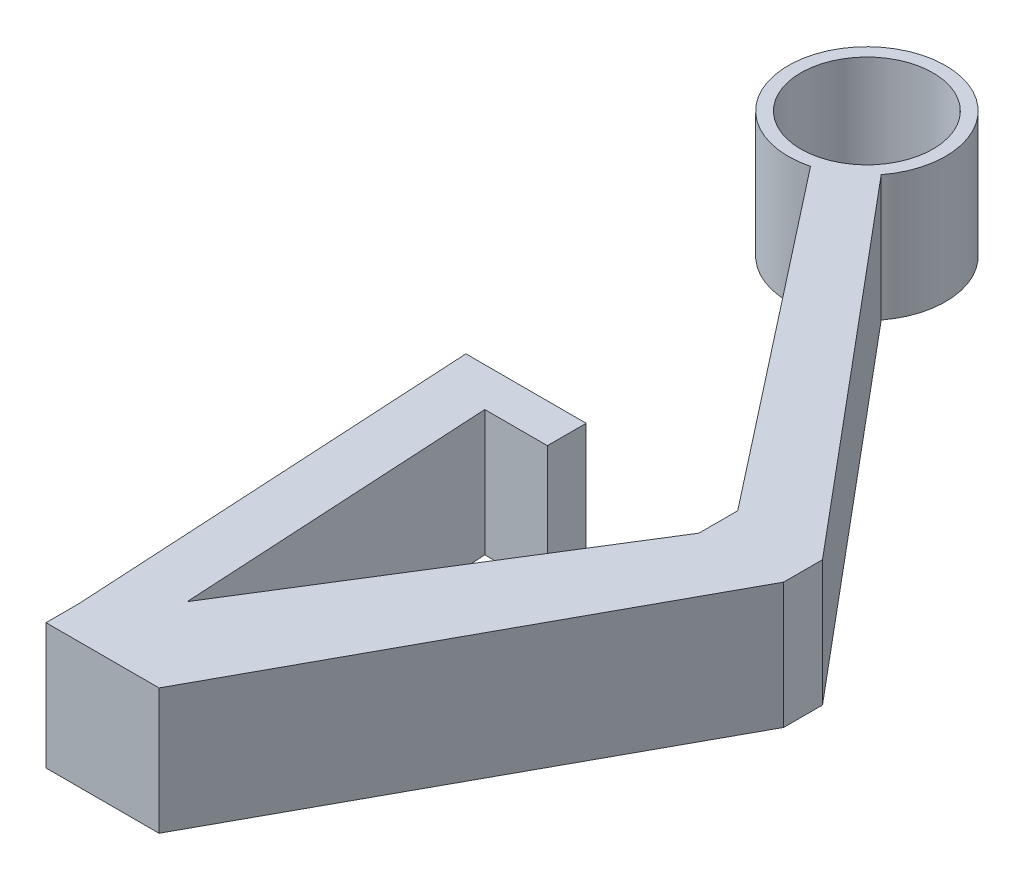
ISO-10303-21;
HEADER;
FILE_DESCRIPTION(('STEP AP214'),'2;1');
FILE_NAME('part.step','',(''),(''),'','','');
FILE_SCHEMA(('AUTOMOTIVE_DESIGN { 1 0 10303 214 1 1 1 1 }'));
ENDSEC;
DATA;
#1=APPLICATION_CONTEXT('core data for automotive mechanical design processes');
#2=APPLICATION_PROTOCOL_DEFINITION('international standard','automotive_design',2000,#1);
#3=PRODUCT_CONTEXT('',#1,'mechanical');
#4=PRODUCT('Part','Part','',(#3));
#5=PRODUCT_RELATED_PRODUCT_CATEGORY('part','',(#4));
#6=PRODUCT_DEFINITION_FORMATION('','',#4);
#7=PRODUCT_DEFINITION_CONTEXT('part definition',#1,'design');
#8=PRODUCT_DEFINITION('design','',#6,#7);
#9=PRODUCT_DEFINITION_SHAPE('','',#8);
#10=(LENGTH_UNIT() NAMED_UNIT(*) SI_UNIT(.MILLI.,.METRE.));
#11=(NAMED_UNIT(*) PLANE_ANGLE_UNIT() SI_UNIT($,.RADIAN.));
#12=(NAMED_UNIT(*) SI_UNIT($,.STERADIAN.) SOLID_ANGLE_UNIT());
#13=UNCERTAINTY_MEASURE_WITH_UNIT(LENGTH_MEASURE(1.E-05),#10,'distance_accuracy_value','');
#14=(GEOMETRIC_REPRESENTATION_CONTEXT(3) GLOBAL_UNCERTAINTY_ASSIGNED_CONTEXT((#13)) GLOBAL_UNIT_ASSIGNED_CONTEXT((#10,
#11,#12)) REPRESENTATION_CONTEXT('',''));
#15=CARTESIAN_POINT('',(0.,0.,0.));
#16=DIRECTION('',(0.,0.,1.));
#17=DIRECTION('',(1.,0.,0.));
#18=AXIS2_PLACEMENT_3D('',#15,#16,#17);
#19=CARTESIAN_POINT('',(0.,0.8,0.));
#20=DIRECTION('',(0.,-1.,0.));
#21=DIRECTION('',(0.,0.,-1.));
#22=AXIS2_PLACEMENT_3D('',#19,#20,#21);
#23=CYLINDRICAL_SURFACE('',#22,0.5);
#24=DIRECTION('',(0.,-1.,0.));
#25=VECTOR('',#24,1.);
#26=CARTESIAN_POINT('',(0.125675276411165,0.8,0.483948060125234));
#27=LINE('',#26,#25);
#28=CARTESIAN_POINT('',(0.125675276411165,0.8,0.483948060125234));
#29=VERTEX_POINT('',#28);
#30=CARTESIAN_POINT('',(0.125675276411165,0.,0.483948060125234));
#31=VERTEX_POINT('',#30);
#32=EDGE_CURVE('E11',#29,#31,#27,.T.);
#33=ORIENTED_EDGE('',*,*,#32,.F.);
#34=CARTESIAN_POINT('',(0.,0.8,0.));
#35=DIRECTION('',(0.,1.,0.));
#36=DIRECTION('',(0.,0.,1.));
#37=AXIS2_PLACEMENT_3D('',#34,#35,#36);
#38=CIRCLE('',#37,0.5);
#39=CARTESIAN_POINT('',(0.396050279808786,0.8,0.305195307734871));
#40=VERTEX_POINT('',#39);
#41=EDGE_CURVE('E44',#40,#29,#38,.T.);
#42=ORIENTED_EDGE('',*,*,#41,.F.);
#43=DIRECTION('',(0.,-1.,0.));
#44=VECTOR('',#43,1.);
#45=CARTESIAN_POINT('',(0.396050279808786,0.8,0.305195307734871));
#46=LINE('',#45,#44);
#47=CARTESIAN_POINT('',(0.396050279808786,0.,0.305195307734871));
#48=VERTEX_POINT('',#47);
#49=EDGE_CURVE('E180',#40,#48,#46,.T.);
#50=ORIENTED_EDGE('',*,*,#49,.T.);
#51=CARTESIAN_POINT('',(0.,0.,0.));
#52=DIRECTION('',(0.,1.,0.));
#53=DIRECTION('',(0.,0.,1.));
#54=AXIS2_PLACEMENT_3D('',#51,#52,#53);
#55=CIRCLE('',#54,0.5);
#56=EDGE_CURVE('E51',#48,#31,#55,.T.);
#57=ORIENTED_EDGE('',*,*,#56,.T.);
#58=EDGE_LOOP('',(#33,#42,#50,#57));
#59=FACE_BOUND('',#58,.T.);
#60=ADVANCED_FACE('F37',(#59),#23,.T.);
#61=CARTESIAN_POINT('',(0.,0.8,0.));
#62=DIRECTION('',(0.,1.,0.));
#63=DIRECTION('',(0.,0.,1.));
#64=AXIS2_PLACEMENT_3D('',#61,#62,#63);
#65=PLANE('',#64);
#66=DIRECTION('',(-0.64236019721875,0.,-0.766402881668048));
#67=VECTOR('',#66,1.);
#68=CARTESIAN_POINT('',(2.32829872516162,0.8,2.61056974255951));
#69=LINE('',#68,#67);
#70=CARTESIAN_POINT('',(2.32829872516162,0.8,2.61056974255951));
#71=VERTEX_POINT('',#70);
#72=EDGE_CURVE('E178',#71,#40,#69,.T.);
#73=ORIENTED_EDGE('',*,*,#72,.T.);
#74=ORIENTED_EDGE('',*,*,#41,.T.);
#75=DIRECTION('',(0.61623399546107,0.,0.787563116732929));
#76=VECTOR('',#75,1.);
#77=CARTESIAN_POINT('',(0.10828611230571,0.8,0.461724254913019));
#78=LINE('',#77,#76);
#79=CARTESIAN_POINT('',(1.7896645470578,0.8,2.61056974255951));
#80=VERTEX_POINT('',#79);
#81=EDGE_CURVE('E133',#29,#80,#78,.T.);
#82=ORIENTED_EDGE('',*,*,#81,.T.);
#83=DIRECTION('',(0.,0.,1.));
#84=VECTOR('',#83,1.);
#85=CARTESIAN_POINT('',(1.7896645470578,0.8,2.61056974255951));
#86=LINE('',#85,#84);
#87=CARTESIAN_POINT('',(1.7896645470578,0.8,2.85704928426543));
#88=VERTEX_POINT('',#87);
#89=EDGE_CURVE('E138',#80,#88,#86,.T.);
#90=ORIENTED_EDGE('',*,*,#89,.T.);
#91=DIRECTION('',(-0.529044610325075,0.,0.848594013816966));
#92=VECTOR('',#91,1.);
#93=CARTESIAN_POINT('',(1.7896645470578,0.8,2.85704928426543));
#94=LINE('',#93,#92);
#95=CARTESIAN_POINT('',(0.540630382350235,0.8,4.86051533332401));
#96=VERTEX_POINT('',#95);
#97=EDGE_CURVE('E156',#88,#96,#94,.T.);
#98=ORIENTED_EDGE('',*,*,#97,.T.);
#99=DIRECTION('',(-0.0556411930324533,0.,-0.998450828853342));
#100=VECTOR('',#99,1.);
#101=CARTESIAN_POINT('',(0.540630382350235,0.8,4.86051533332401));
#102=LINE('',#101,#100);
#103=CARTESIAN_POINT('',(0.428982179005402,0.8,2.85704928426543));
#104=VERTEX_POINT('',#103);
#105=EDGE_CURVE('E158',#96,#104,#102,.T.);
#106=ORIENTED_EDGE('',*,*,#105,.T.);
#107=DIRECTION('',(1.,0.,0.));
#108=VECTOR('',#107,1.);
#109=CARTESIAN_POINT('',(0.428982179005402,0.8,2.85704928426543));
#110=LINE('',#109,#108);
#111=CARTESIAN_POINT('',(0.826811996105691,0.8,2.85704928426543));
#112=VERTEX_POINT('',#111);
#113=EDGE_CURVE('E162',#104,#112,#110,.T.);
#114=ORIENTED_EDGE('',*,*,#113,.T.);
#115=DIRECTION('',(0.,0.,-1.));
#116=VECTOR('',#115,1.);
#117=CARTESIAN_POINT('',(0.826811996105691,0.8,2.85704928426543));
#118=LINE('',#117,#116);
#119=CARTESIAN_POINT('',(0.826811996105691,0.8,2.61056974255951));
#120=VERTEX_POINT('',#119);
#121=EDGE_CURVE('E164',#112,#120,#118,.T.);
#122=ORIENTED_EDGE('',*,*,#121,.T.);
#123=DIRECTION('',(-1.,0.,0.));
#124=VECTOR('',#123,1.);
#125=CARTESIAN_POINT('',(0.826811996105691,0.8,2.61056974255951));
#126=LINE('',#125,#124);
#127=CARTESIAN_POINT('',(0.0624919750122658,0.8,2.61056974255951));
#128=VERTEX_POINT('',#127);
#129=EDGE_CURVE('E166',#120,#128,#126,.T.);
#130=ORIENTED_EDGE('',*,*,#129,.T.);
#131=DIRECTION('',(0.0556411930324533,0.,0.998450828853342));
#132=VECTOR('',#131,1.);
#133=CARTESIAN_POINT('',(0.0624919750122658,0.8,2.61056974255951));
#134=LINE('',#133,#132);
#135=CARTESIAN_POINT('',(0.20781017284824,0.8,5.21822545893093));
#136=VERTEX_POINT('',#135);
#137=EDGE_CURVE('E168',#128,#136,#134,.T.);
#138=ORIENTED_EDGE('',*,*,#137,.T.);
#139=DIRECTION('',(0.,0.,1.));
#140=VECTOR('',#139,1.);
#141=CARTESIAN_POINT('',(0.20781017284824,0.8,5.21822545893093));
#142=LINE('',#141,#140);
#143=CARTESIAN_POINT('',(0.20781017284824,0.8,5.42410455342405));
#144=VERTEX_POINT('',#143);
#145=EDGE_CURVE('E170',#136,#144,#142,.T.);
#146=ORIENTED_EDGE('',*,*,#145,.T.);
#147=DIRECTION('',(1.,0.,0.));
#148=VECTOR('',#147,1.);
#149=CARTESIAN_POINT('',(0.20781017284824,0.8,5.42410455342405));
#150=LINE('',#149,#148);
#151=CARTESIAN_POINT('',(0.926078261035032,0.8,5.42410455342405));
#152=VERTEX_POINT('',#151);
#153=EDGE_CURVE('E172',#144,#152,#150,.T.);
#154=ORIENTED_EDGE('',*,*,#153,.T.);
#155=DIRECTION('',(0.479381246444352,0.,-0.877606757356311));
#156=VECTOR('',#155,1.);
#157=CARTESIAN_POINT('',(0.926078261035032,0.8,5.42410455342405));
#158=LINE('',#157,#156);
#159=CARTESIAN_POINT('',(2.32829872516162,0.8,2.85704928426543));
#160=VERTEX_POINT('',#159);
#161=EDGE_CURVE('E174',#152,#160,#158,.T.);
#162=ORIENTED_EDGE('',*,*,#161,.T.);
#163=DIRECTION('',(0.,0.,-1.));
#164=VECTOR('',#163,1.);
#165=CARTESIAN_POINT('',(2.32829872516162,0.8,2.85704928426543));
#166=LINE('',#165,#164);
#167=EDGE_CURVE('E176',#160,#71,#166,.T.);
#168=ORIENTED_EDGE('',*,*,#167,.T.);
#169=EDGE_LOOP('',(#73,#74,#82,#90,#98,#106,#114,#122,#130,#138,#146,#154,#162,#168));
#170=FACE_BOUND('',#169,.T.);
#171=CARTESIAN_POINT('',(0.,0.8,0.));
#172=DIRECTION('',(0.,1.,0.));
#173=DIRECTION('',(0.,0.,1.));
#174=AXIS2_PLACEMENT_3D('',#171,#172,#173);
#175=CIRCLE('',#174,0.42);
#176=CARTESIAN_POINT('',(0.,0.8,0.42));
#177=VERTEX_POINT('',#176);
#178=EDGE_CURVE('E238',#177,#177,#175,.T.);
#179=ORIENTED_EDGE('',*,*,#178,.F.);
#180=EDGE_LOOP('',(#179));
#181=FACE_BOUND('',#180,.T.);
#182=ADVANCED_FACE('F135',(#170,#181),#65,.T.);
#183=CARTESIAN_POINT('',(0.,0.,0.));
#184=DIRECTION('',(0.,1.,0.));
#185=DIRECTION('',(0.,0.,1.));
#186=AXIS2_PLACEMENT_3D('',#183,#184,#185);
#187=PLANE('',#186);
#188=ORIENTED_EDGE('',*,*,#56,.F.);
#189=DIRECTION('',(-0.64236019721875,0.,-0.766402881668048));
#190=VECTOR('',#189,1.);
#191=CARTESIAN_POINT('',(2.32829872516162,0.,2.61056974255951));
#192=LINE('',#191,#190);
#193=CARTESIAN_POINT('',(2.32829872516162,0.,2.61056974255951));
#194=VERTEX_POINT('',#193);
#195=EDGE_CURVE('E141',#194,#48,#192,.T.);
#196=ORIENTED_EDGE('',*,*,#195,.F.);
#197=DIRECTION('',(0.,0.,-1.));
#198=VECTOR('',#197,1.);
#199=CARTESIAN_POINT('',(2.32829872516162,0.,2.85704928426543));
#200=LINE('',#199,#198);
#201=CARTESIAN_POINT('',(2.32829872516162,0.,2.85704928426543));
#202=VERTEX_POINT('',#201);
#203=EDGE_CURVE('E202',#202,#194,#200,.T.);
#204=ORIENTED_EDGE('',*,*,#203,.F.);
#205=DIRECTION('',(0.479381246444352,0.,-0.877606757356311));
#206=VECTOR('',#205,1.);
#207=CARTESIAN_POINT('',(0.926078261035032,0.,5.42410455342405));
#208=LINE('',#207,#206);
#209=CARTESIAN_POINT('',(0.926078261035032,0.,5.42410455342405));
#210=VERTEX_POINT('',#209);
#211=EDGE_CURVE('E200',#210,#202,#208,.T.);
#212=ORIENTED_EDGE('',*,*,#211,.F.);
#213=DIRECTION('',(1.,0.,0.));
#214=VECTOR('',#213,1.);
#215=CARTESIAN_POINT('',(0.20781017284824,0.,5.42410455342405));
#216=LINE('',#215,#214);
#217=CARTESIAN_POINT('',(0.20781017284824,0.,5.42410455342405));
#218=VERTEX_POINT('',#217);
#219=EDGE_CURVE('E198',#218,#210,#216,.T.);
#220=ORIENTED_EDGE('',*,*,#219,.F.);
#221=DIRECTION('',(0.,0.,1.));
#222=VECTOR('',#221,1.);
#223=CARTESIAN_POINT('',(0.20781017284824,0.,5.21822545893093));
#224=LINE('',#223,#222);
#225=CARTESIAN_POINT('',(0.20781017284824,0.,5.21822545893093));
#226=VERTEX_POINT('',#225);
#227=EDGE_CURVE('E196',#226,#218,#224,.T.);
#228=ORIENTED_EDGE('',*,*,#227,.F.);
#229=DIRECTION('',(0.0556411930324533,0.,0.998450828853342));
#230=VECTOR('',#229,1.);
#231=CARTESIAN_POINT('',(0.0624919750122658,0.,2.61056974255951));
#232=LINE('',#231,#230);
#233=CARTESIAN_POINT('',(0.0624919750122658,0.,2.61056974255951));
#234=VERTEX_POINT('',#233);
#235=EDGE_CURVE('E194',#234,#226,#232,.T.);
#236=ORIENTED_EDGE('',*,*,#235,.F.);
#237=DIRECTION('',(-1.,0.,0.));
#238=VECTOR('',#237,1.);
#239=CARTESIAN_POINT('',(0.826811996105691,0.,2.61056974255951));
#240=LINE('',#239,#238);
#241=CARTESIAN_POINT('',(0.826811996105691,0.,2.61056974255951));
#242=VERTEX_POINT('',#241);
#243=EDGE_CURVE('E192',#242,#234,#240,.T.);
#244=ORIENTED_EDGE('',*,*,#243,.F.);
#245=DIRECTION('',(0.,0.,-1.));
#246=VECTOR('',#245,1.);
#247=CARTESIAN_POINT('',(0.826811996105691,0.,2.85704928426543));
#248=LINE('',#247,#246);
#249=CARTESIAN_POINT('',(0.826811996105691,0.,2.85704928426543));
#250=VERTEX_POINT('',#249);
#251=EDGE_CURVE('E190',#250,#242,#248,.T.);
#252=ORIENTED_EDGE('',*,*,#251,.F.);
#253=DIRECTION('',(1.,0.,0.));
#254=VECTOR('',#253,1.);
#255=CARTESIAN_POINT('',(0.428982179005402,0.,2.85704928426543));
#256=LINE('',#255,#254);
#257=CARTESIAN_POINT('',(0.428982179005402,0.,2.85704928426543));
#258=VERTEX_POINT('',#257);
#259=EDGE_CURVE('E188',#258,#250,#256,.T.);
#260=ORIENTED_EDGE('',*,*,#259,.F.);
#261=DIRECTION('',(-0.0556411930324533,0.,-0.998450828853342));
#262=VECTOR('',#261,1.);
#263=CARTESIAN_POINT('',(0.540630382350235,0.,4.86051533332401));
#264=LINE('',#263,#262);
#265=CARTESIAN_POINT('',(0.540630382350235,0.,4.86051533332401));
#266=VERTEX_POINT('',#265);
#267=EDGE_CURVE('E186',#266,#258,#264,.T.);
#268=ORIENTED_EDGE('',*,*,#267,.F.);
#269=DIRECTION('',(-0.529044610325075,0.,0.848594013816966));
#270=VECTOR('',#269,1.);
#271=CARTESIAN_POINT('',(1.7896645470578,0.,2.85704928426543));
#272=LINE('',#271,#270);
#273=CARTESIAN_POINT('',(1.7896645470578,0.,2.85704928426543));
#274=VERTEX_POINT('',#273);
#275=EDGE_CURVE('E184',#274,#266,#272,.T.);
#276=ORIENTED_EDGE('',*,*,#275,.F.);
#277=DIRECTION('',(0.,0.,1.));
#278=VECTOR('',#277,1.);
#279=CARTESIAN_POINT('',(1.7896645470578,0.,2.61056974255951));
#280=LINE('',#279,#278);
#281=CARTESIAN_POINT('',(1.7896645470578,0.,2.61056974255951));
#282=VERTEX_POINT('',#281);
#283=EDGE_CURVE('E182',#282,#274,#280,.T.);
#284=ORIENTED_EDGE('',*,*,#283,.F.);
#285=DIRECTION('',(0.61623399546107,0.,0.787563116732929));
#286=VECTOR('',#285,1.);
#287=CARTESIAN_POINT('',(0.10828611230571,0.,0.461724254913019));
#288=LINE('',#287,#286);
#289=EDGE_CURVE('E147',#31,#282,#288,.T.);
#290=ORIENTED_EDGE('',*,*,#289,.F.);
#291=EDGE_LOOP('',(#188,#196,#204,#212,#220,#228,#236,#244,#252,#260,#268,#276,#284,#290));
#292=FACE_BOUND('',#291,.T.);
#293=CARTESIAN_POINT('',(0.,0.,0.));
#294=DIRECTION('',(0.,1.,0.));
#295=DIRECTION('',(0.,0.,1.));
#296=AXIS2_PLACEMENT_3D('',#293,#294,#295);
#297=CIRCLE('',#296,0.42);
#298=CARTESIAN_POINT('',(0.,0.,0.42));
#299=VERTEX_POINT('',#298);
#300=EDGE_CURVE('E150',#299,#299,#297,.T.);
#301=ORIENTED_EDGE('',*,*,#300,.T.);
#302=EDGE_LOOP('',(#301));
#303=FACE_BOUND('',#302,.T.);
#304=ADVANCED_FACE('F245',(#292,#303),#187,.F.);
#305=CARTESIAN_POINT('',(0.,0.8,0.));
#306=DIRECTION('',(0.,-1.,0.));
#307=DIRECTION('',(0.,0.,-1.));
#308=AXIS2_PLACEMENT_3D('',#305,#306,#307);
#309=CYLINDRICAL_SURFACE('',#308,0.42);
#310=ORIENTED_EDGE('',*,*,#178,.T.);
#311=EDGE_LOOP('',(#310));
#312=FACE_BOUND('',#311,.T.);
#313=ORIENTED_EDGE('',*,*,#300,.F.);
#314=EDGE_LOOP('',(#313));
#315=FACE_BOUND('',#314,.T.);
#316=ADVANCED_FACE('F247',(#312,#315),#309,.F.);
#317=CARTESIAN_POINT('',(0.10828611230571,0.8,0.461724254913019));
#318=DIRECTION('',(0.787563116732929,0.,-0.61623399546107));
#319=DIRECTION('',(-0.61623399546107,0.,-0.787563116732929));
#320=AXIS2_PLACEMENT_3D('',#317,#318,#319);
#321=PLANE('',#320);
#322=ORIENTED_EDGE('',*,*,#81,.F.);
#323=ORIENTED_EDGE('',*,*,#32,.T.);
#324=ORIENTED_EDGE('',*,*,#289,.T.);
#325=DIRECTION('',(0.,-1.,0.));
#326=VECTOR('',#325,1.);
#327=CARTESIAN_POINT('',(1.7896645470578,0.8,2.61056974255951));
#328=LINE('',#327,#326);
#329=EDGE_CURVE('E144',#80,#282,#328,.T.);
#330=ORIENTED_EDGE('',*,*,#329,.F.);
#331=EDGE_LOOP('',(#322,#323,#324,#330));
#332=FACE_BOUND('',#331,.T.);
#333=ADVANCED_FACE('F145',(#332),#321,.F.);
#334=CARTESIAN_POINT('',(1.7896645470578,0.8,2.61056974255951));
#335=DIRECTION('',(1.,0.,0.));
#336=DIRECTION('',(0.,0.,-1.));
#337=AXIS2_PLACEMENT_3D('',#334,#335,#336);
#338=PLANE('',#337);
#339=ORIENTED_EDGE('',*,*,#283,.T.);
#340=DIRECTION('',(0.,-1.,0.));
#341=VECTOR('',#340,1.);
#342=CARTESIAN_POINT('',(1.7896645470578,0.8,2.85704928426543));
#343=LINE('',#342,#341);
#344=EDGE_CURVE('E151',#88,#274,#343,.T.);
#345=ORIENTED_EDGE('',*,*,#344,.F.);
#346=ORIENTED_EDGE('',*,*,#89,.F.);
#347=ORIENTED_EDGE('',*,*,#329,.T.);
#348=EDGE_LOOP('',(#339,#345,#346,#347));
#349=FACE_BOUND('',#348,.T.);
#350=ADVANCED_FACE('F153',(#349),#338,.F.);
#351=CARTESIAN_POINT('',(1.7896645470578,0.8,2.85704928426543));
#352=DIRECTION('',(0.848594013816966,0.,0.529044610325075));
#353=DIRECTION('',(0.529044610325075,0.,-0.848594013816966));
#354=AXIS2_PLACEMENT_3D('',#351,#352,#353);
#355=PLANE('',#354);
#356=ORIENTED_EDGE('',*,*,#275,.T.);
#357=DIRECTION('',(0.,-1.,0.));
#358=VECTOR('',#357,1.);
#359=CARTESIAN_POINT('',(0.540630382350235,0.8,4.86051533332401));
#360=LINE('',#359,#358);
#361=EDGE_CURVE('E234',#96,#266,#360,.T.);
#362=ORIENTED_EDGE('',*,*,#361,.F.);
#363=ORIENTED_EDGE('',*,*,#97,.F.);
#364=ORIENTED_EDGE('',*,*,#344,.T.);
#365=EDGE_LOOP('',(#356,#362,#363,#364));
#366=FACE_BOUND('',#365,.T.);
#367=ADVANCED_FACE('F266',(#366),#355,.F.);
#368=CARTESIAN_POINT('',(0.540630382350235,0.8,4.86051533332401));
#369=DIRECTION('',(-0.998450828853342,0.,0.0556411930324533));
#370=DIRECTION('',(0.0556411930324533,0.,0.998450828853342));
#371=AXIS2_PLACEMENT_3D('',#368,#369,#370);
#372=PLANE('',#371);
#373=ORIENTED_EDGE('',*,*,#267,.T.);
#374=DIRECTION('',(0.,-1.,0.));
#375=VECTOR('',#374,1.);
#376=CARTESIAN_POINT('',(0.428982179005402,0.8,2.85704928426543));
#377=LINE('',#376,#375);
#378=EDGE_CURVE('E231',#104,#258,#377,.T.);
#379=ORIENTED_EDGE('',*,*,#378,.F.);
#380=ORIENTED_EDGE('',*,*,#105,.F.);
#381=ORIENTED_EDGE('',*,*,#361,.T.);
#382=EDGE_LOOP('',(#373,#379,#380,#381));
#383=FACE_BOUND('',#382,.T.);
#384=ADVANCED_FACE('F273',(#383),#372,.F.);
#385=CARTESIAN_POINT('',(0.428982179005402,0.8,2.85704928426543));
#386=DIRECTION('',(0.,0.,-1.));
#387=DIRECTION('',(-1.,0.,0.));
#388=AXIS2_PLACEMENT_3D('',#385,#386,#387);
#389=PLANE('',#388);
#390=ORIENTED_EDGE('',*,*,#259,.T.);
#391=DIRECTION('',(0.,-1.,0.));
#392=VECTOR('',#391,1.);
#393=CARTESIAN_POINT('',(0.826811996105691,0.8,2.85704928426543));
#394=LINE('',#393,#392);
#395=EDGE_CURVE('E228',#112,#250,#394,.T.);
#396=ORIENTED_EDGE('',*,*,#395,.F.);
#397=ORIENTED_EDGE('',*,*,#113,.F.);
#398=ORIENTED_EDGE('',*,*,#378,.T.);
#399=EDGE_LOOP('',(#390,#396,#397,#398));
#400=FACE_BOUND('',#399,.T.);
#401=ADVANCED_FACE('F276',(#400),#389,.F.);
#402=CARTESIAN_POINT('',(0.826811996105691,0.8,2.85704928426543));
#403=DIRECTION('',(-1.,0.,0.));
#404=DIRECTION('',(0.,0.,1.));
#405=AXIS2_PLACEMENT_3D('',#402,#403,#404);
#406=PLANE('',#405);
#407=ORIENTED_EDGE('',*,*,#251,.T.);
#408=DIRECTION('',(0.,-1.,0.));
#409=VECTOR('',#408,1.);
#410=CARTESIAN_POINT('',(0.826811996105691,0.8,2.61056974255951));
#411=LINE('',#410,#409);
#412=EDGE_CURVE('E225',#120,#242,#411,.T.);
#413=ORIENTED_EDGE('',*,*,#412,.F.);
#414=ORIENTED_EDGE('',*,*,#121,.F.);
#415=ORIENTED_EDGE('',*,*,#395,.T.);
#416=EDGE_LOOP('',(#407,#413,#414,#415));
#417=FACE_BOUND('',#416,.T.);
#418=ADVANCED_FACE('F281',(#417),#406,.F.);
#419=CARTESIAN_POINT('',(0.826811996105691,0.8,2.61056974255951));
#420=DIRECTION('',(0.,0.,1.));
#421=DIRECTION('',(1.,0.,0.));
#422=AXIS2_PLACEMENT_3D('',#419,#420,#421);
#423=PLANE('',#422);
#424=ORIENTED_EDGE('',*,*,#243,.T.);
#425=DIRECTION('',(0.,-1.,0.));
#426=VECTOR('',#425,1.);
#427=CARTESIAN_POINT('',(0.0624919750122658,0.8,2.61056974255951));
#428=LINE('',#427,#426);
#429=EDGE_CURVE('E222',#128,#234,#428,.T.);
#430=ORIENTED_EDGE('',*,*,#429,.F.);
#431=ORIENTED_EDGE('',*,*,#129,.F.);
#432=ORIENTED_EDGE('',*,*,#412,.T.);
#433=EDGE_LOOP('',(#424,#430,#431,#432));
#434=FACE_BOUND('',#433,.T.);
#435=ADVANCED_FACE('F287',(#434),#423,.F.);
#436=CARTESIAN_POINT('',(0.0624919750122658,0.8,2.61056974255951));
#437=DIRECTION('',(0.998450828853342,0.,-0.0556411930324533));
#438=DIRECTION('',(-0.0556411930324533,0.,-0.998450828853342));
#439=AXIS2_PLACEMENT_3D('',#436,#437,#438);
#440=PLANE('',#439);
#441=ORIENTED_EDGE('',*,*,#235,.T.);
#442=DIRECTION('',(0.,-1.,0.));
#443=VECTOR('',#442,1.);
#444=CARTESIAN_POINT('',(0.20781017284824,0.8,5.21822545893093));
#445=LINE('',#444,#443);
#446=EDGE_CURVE('E219',#136,#226,#445,.T.);
#447=ORIENTED_EDGE('',*,*,#446,.F.);
#448=ORIENTED_EDGE('',*,*,#137,.F.);
#449=ORIENTED_EDGE('',*,*,#429,.T.);
#450=EDGE_LOOP('',(#441,#447,#448,#449));
#451=FACE_BOUND('',#450,.T.);
#452=ADVANCED_FACE('F291',(#451),#440,.F.);
#453=CARTESIAN_POINT('',(0.20781017284824,0.8,5.21822545893093));
#454=DIRECTION('',(1.,0.,0.));
#455=DIRECTION('',(0.,0.,-1.));
#456=AXIS2_PLACEMENT_3D('',#453,#454,#455);
#457=PLANE('',#456);
#458=ORIENTED_EDGE('',*,*,#227,.T.);
#459=DIRECTION('',(0.,-1.,0.));
#460=VECTOR('',#459,1.);
#461=CARTESIAN_POINT('',(0.20781017284824,0.8,5.42410455342405));
#462=LINE('',#461,#460);
#463=EDGE_CURVE('E216',#144,#218,#462,.T.);
#464=ORIENTED_EDGE('',*,*,#463,.F.);
#465=ORIENTED_EDGE('',*,*,#145,.F.);
#466=ORIENTED_EDGE('',*,*,#446,.T.);
#467=EDGE_LOOP('',(#458,#464,#465,#466));
#468=FACE_BOUND('',#467,.T.);
#469=ADVANCED_FACE('F296',(#468),#457,.F.);
#470=CARTESIAN_POINT('',(0.20781017284824,0.8,5.42410455342405));
#471=DIRECTION('',(0.,0.,-1.));
#472=DIRECTION('',(-1.,0.,0.));
#473=AXIS2_PLACEMENT_3D('',#470,#471,#472);
#474=PLANE('',#473);
#475=ORIENTED_EDGE('',*,*,#219,.T.);
#476=DIRECTION('',(0.,-1.,0.));
#477=VECTOR('',#476,1.);
#478=CARTESIAN_POINT('',(0.926078261035032,0.8,5.42410455342405));
#479=LINE('',#478,#477);
#480=EDGE_CURVE('E213',#152,#210,#479,.T.);
#481=ORIENTED_EDGE('',*,*,#480,.F.);
#482=ORIENTED_EDGE('',*,*,#153,.F.);
#483=ORIENTED_EDGE('',*,*,#463,.T.);
#484=EDGE_LOOP('',(#475,#481,#482,#483));
#485=FACE_BOUND('',#484,.T.);
#486=ADVANCED_FACE('F302',(#485),#474,.F.);
#487=CARTESIAN_POINT('',(0.926078261035032,0.8,5.42410455342405));
#488=DIRECTION('',(-0.877606757356311,0.,-0.479381246444352));
#489=DIRECTION('',(-0.479381246444352,0.,0.877606757356311));
#490=AXIS2_PLACEMENT_3D('',#487,#488,#489);
#491=PLANE('',#490);
#492=ORIENTED_EDGE('',*,*,#211,.T.);
#493=DIRECTION('',(0.,-1.,0.));
#494=VECTOR('',#493,1.);
#495=CARTESIAN_POINT('',(2.32829872516162,0.8,2.85704928426543));
#496=LINE('',#495,#494);
#497=EDGE_CURVE('E210',#160,#202,#496,.T.);
#498=ORIENTED_EDGE('',*,*,#497,.F.);
#499=ORIENTED_EDGE('',*,*,#161,.F.);
#500=ORIENTED_EDGE('',*,*,#480,.T.);
#501=EDGE_LOOP('',(#492,#498,#499,#500));
#502=FACE_BOUND('',#501,.T.);
#503=ADVANCED_FACE('F306',(#502),#491,.F.);
#504=CARTESIAN_POINT('',(2.32829872516162,0.8,2.85704928426543));
#505=DIRECTION('',(-1.,0.,0.));
#506=DIRECTION('',(0.,0.,1.));
#507=AXIS2_PLACEMENT_3D('',#504,#505,#506);
#508=PLANE('',#507);
#509=ORIENTED_EDGE('',*,*,#203,.T.);
#510=DIRECTION('',(0.,-1.,0.));
#511=VECTOR('',#510,1.);
#512=CARTESIAN_POINT('',(2.32829872516162,0.8,2.61056974255951));
#513=LINE('',#512,#511);
#514=EDGE_CURVE('E207',#71,#194,#513,.T.);
#515=ORIENTED_EDGE('',*,*,#514,.F.);
#516=ORIENTED_EDGE('',*,*,#167,.F.);
#517=ORIENTED_EDGE('',*,*,#497,.T.);
#518=EDGE_LOOP('',(#509,#515,#516,#517));
#519=FACE_BOUND('',#518,.T.);
#520=ADVANCED_FACE('F311',(#519),#508,.F.);
#521=CARTESIAN_POINT('',(2.32829872516162,0.8,2.61056974255951));
#522=DIRECTION('',(-0.766402881668048,0.,0.64236019721875));
#523=DIRECTION('',(0.64236019721875,0.,0.766402881668048));
#524=AXIS2_PLACEMENT_3D('',#521,#522,#523);
#525=PLANE('',#524);
#526=ORIENTED_EDGE('',*,*,#195,.T.);
#527=ORIENTED_EDGE('',*,*,#49,.F.);
#528=ORIENTED_EDGE('',*,*,#72,.F.);
#529=ORIENTED_EDGE('',*,*,#514,.T.);
#530=EDGE_LOOP('',(#526,#527,#528,#529));
#531=FACE_BOUND('',#530,.T.);
#532=ADVANCED_FACE('F315',(#531),#525,.F.);
#533=CLOSED_SHELL('',(#60,#182,#304,#316,#333,#350,#367,#384,#401,#418,#435,#452,#469,#486,#503,
#520,#532));
#534=MANIFOLD_SOLID_BREP('B2',#533);
#535=ADVANCED_BREP_SHAPE_REPRESENTATION('',(#18,#534),#14);
#536=SHAPE_DEFINITION_REPRESENTATION(#9,#535);
ENDSEC;
END-ISO-10303-21;
